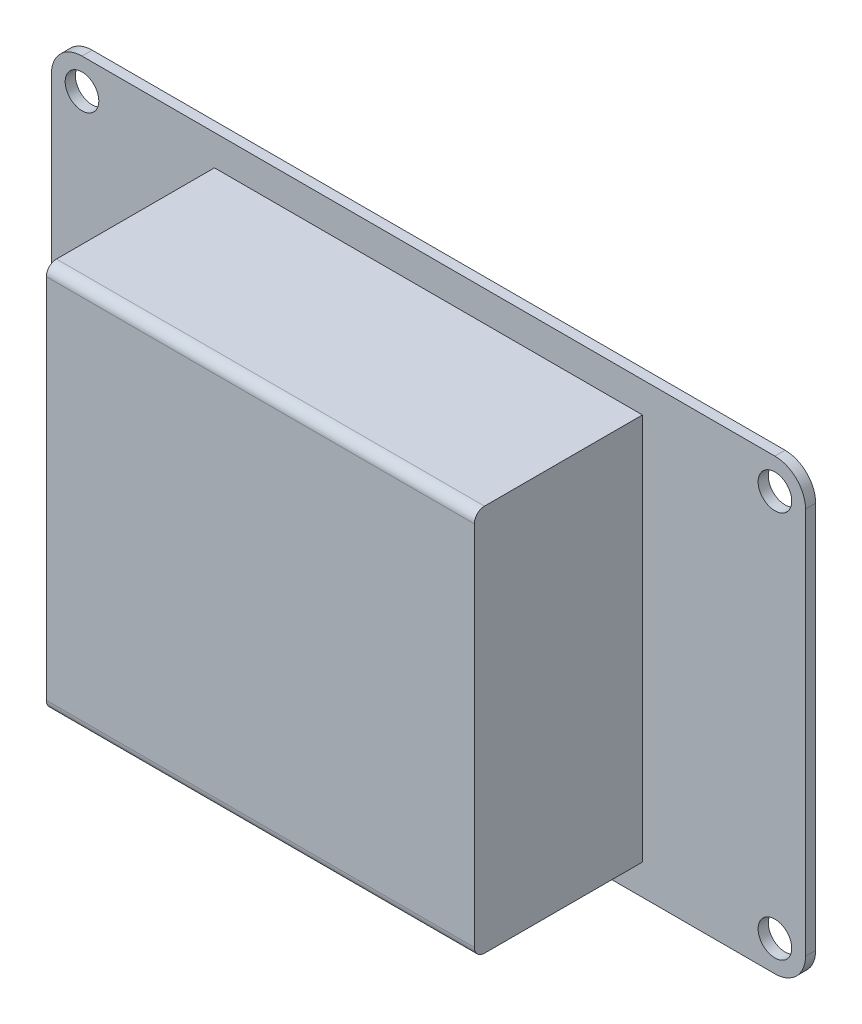
ISO-10303-21;
HEADER;
FILE_DESCRIPTION(('STEP AP214'),'2;1');
FILE_NAME('part.step','',(''),(''),'','','');
FILE_SCHEMA(('AUTOMOTIVE_DESIGN { 1 0 10303 214 1 1 1 1 }'));
ENDSEC;
DATA;
#1=APPLICATION_CONTEXT('core data for automotive mechanical design processes');
#2=APPLICATION_PROTOCOL_DEFINITION('international standard','automotive_design',2000,#1);
#3=PRODUCT_CONTEXT('',#1,'mechanical');
#4=PRODUCT('Part','Part','',(#3));
#5=PRODUCT_RELATED_PRODUCT_CATEGORY('part','',(#4));
#6=PRODUCT_DEFINITION_FORMATION('','',#4);
#7=PRODUCT_DEFINITION_CONTEXT('part definition',#1,'design');
#8=PRODUCT_DEFINITION('design','',#6,#7);
#9=PRODUCT_DEFINITION_SHAPE('','',#8);
#10=(LENGTH_UNIT() NAMED_UNIT(*) SI_UNIT(.MILLI.,.METRE.));
#11=(NAMED_UNIT(*) PLANE_ANGLE_UNIT() SI_UNIT($,.RADIAN.));
#12=(NAMED_UNIT(*) SI_UNIT($,.STERADIAN.) SOLID_ANGLE_UNIT());
#13=UNCERTAINTY_MEASURE_WITH_UNIT(LENGTH_MEASURE(1.E-05),#10,'distance_accuracy_value','');
#14=(GEOMETRIC_REPRESENTATION_CONTEXT(3) GLOBAL_UNCERTAINTY_ASSIGNED_CONTEXT((#13)) GLOBAL_UNIT_ASSIGNED_CONTEXT((#10,
#11,#12)) REPRESENTATION_CONTEXT('',''));
#15=CARTESIAN_POINT('',(0.,0.,0.));
#16=DIRECTION('',(0.,0.,1.));
#17=DIRECTION('',(1.,0.,0.));
#18=AXIS2_PLACEMENT_3D('',#15,#16,#17);
#19=CARTESIAN_POINT('',(34.,-19.,1.));
#20=DIRECTION('',(0.,0.,-1.));
#21=DIRECTION('',(-1.,0.,0.));
#22=AXIS2_PLACEMENT_3D('',#19,#20,#21);
#23=PLANE('',#22);
#24=CARTESIAN_POINT('',(34.,-18.9999999999991,1.));
#25=DIRECTION('',(0.,0.,1.));
#26=DIRECTION('',(1.,0.,0.));
#27=AXIS2_PLACEMENT_3D('',#24,#25,#26);
#28=CIRCLE('',#27,1.65);
#29=CARTESIAN_POINT('',(35.65,-18.9999999999991,1.));
#30=VERTEX_POINT('',#29);
#31=EDGE_CURVE('E174',#30,#30,#28,.T.);
#32=ORIENTED_EDGE('',*,*,#31,.F.);
#33=EDGE_LOOP('',(#32));
#34=FACE_BOUND('',#33,.T.);
#35=CARTESIAN_POINT('',(34.,19.0000000000009,1.));
#36=DIRECTION('',(0.,0.,1.));
#37=DIRECTION('',(1.,0.,0.));
#38=AXIS2_PLACEMENT_3D('',#35,#36,#37);
#39=CIRCLE('',#38,1.65);
#40=CARTESIAN_POINT('',(35.65,19.0000000000009,1.));
#41=VERTEX_POINT('',#40);
#42=EDGE_CURVE('E179',#41,#41,#39,.T.);
#43=ORIENTED_EDGE('',*,*,#42,.F.);
#44=EDGE_LOOP('',(#43));
#45=FACE_BOUND('',#44,.T.);
#46=CARTESIAN_POINT('',(-34.,19.,1.));
#47=DIRECTION('',(0.,0.,1.));
#48=DIRECTION('',(1.,0.,0.));
#49=AXIS2_PLACEMENT_3D('',#46,#47,#48);
#50=CIRCLE('',#49,1.65);
#51=CARTESIAN_POINT('',(-32.35,19.,1.));
#52=VERTEX_POINT('',#51);
#53=EDGE_CURVE('E183',#52,#52,#50,.T.);
#54=ORIENTED_EDGE('',*,*,#53,.F.);
#55=EDGE_LOOP('',(#54));
#56=FACE_BOUND('',#55,.T.);
#57=CARTESIAN_POINT('',(-34.,-19.,1.));
#58=DIRECTION('',(0.,0.,1.));
#59=DIRECTION('',(1.,0.,0.));
#60=AXIS2_PLACEMENT_3D('',#57,#58,#59);
#61=CIRCLE('',#60,1.65);
#62=CARTESIAN_POINT('',(-32.35,-19.,1.));
#63=VERTEX_POINT('',#62);
#64=EDGE_CURVE('E193',#63,#63,#61,.T.);
#65=ORIENTED_EDGE('',*,*,#64,.F.);
#66=EDGE_LOOP('',(#65));
#67=FACE_BOUND('',#66,.T.);
#68=CARTESIAN_POINT('',(34.,-19.,1.));
#69=DIRECTION('',(0.,0.,1.));
#70=DIRECTION('',(-1.,0.,0.));
#71=AXIS2_PLACEMENT_3D('',#68,#69,#70);
#72=CIRCLE('',#71,3.);
#73=CARTESIAN_POINT('',(34.,-22.,1.));
#74=VERTEX_POINT('',#73);
#75=CARTESIAN_POINT('',(37.,-19.,1.));
#76=VERTEX_POINT('',#75);
#77=EDGE_CURVE('E197',#74,#76,#72,.T.);
#78=ORIENTED_EDGE('',*,*,#77,.T.);
#79=DIRECTION('',(0.,1.,0.));
#80=VECTOR('',#79,1.);
#81=CARTESIAN_POINT('',(37.,-19.,1.));
#82=LINE('',#81,#80);
#83=CARTESIAN_POINT('',(37.,19.,1.));
#84=VERTEX_POINT('',#83);
#85=EDGE_CURVE('E199',#76,#84,#82,.T.);
#86=ORIENTED_EDGE('',*,*,#85,.T.);
#87=CARTESIAN_POINT('',(34.,19.,1.));
#88=DIRECTION('',(0.,0.,1.));
#89=DIRECTION('',(1.,0.,0.));
#90=AXIS2_PLACEMENT_3D('',#87,#88,#89);
#91=CIRCLE('',#90,3.);
#92=CARTESIAN_POINT('',(34.,22.,1.));
#93=VERTEX_POINT('',#92);
#94=EDGE_CURVE('E201',#84,#93,#91,.T.);
#95=ORIENTED_EDGE('',*,*,#94,.T.);
#96=DIRECTION('',(-1.,0.,0.));
#97=VECTOR('',#96,1.);
#98=CARTESIAN_POINT('',(34.,22.,1.));
#99=LINE('',#98,#97);
#100=CARTESIAN_POINT('',(-34.,22.,1.));
#101=VERTEX_POINT('',#100);
#102=EDGE_CURVE('E202',#93,#101,#99,.T.);
#103=ORIENTED_EDGE('',*,*,#102,.T.);
#104=CARTESIAN_POINT('',(-34.,19.,1.));
#105=DIRECTION('',(0.,0.,1.));
#106=DIRECTION('',(-1.,0.,0.));
#107=AXIS2_PLACEMENT_3D('',#104,#105,#106);
#108=CIRCLE('',#107,3.);
#109=CARTESIAN_POINT('',(-37.,19.,1.));
#110=VERTEX_POINT('',#109);
#111=EDGE_CURVE('E210',#101,#110,#108,.T.);
#112=ORIENTED_EDGE('',*,*,#111,.T.);
#113=DIRECTION('',(0.,-1.,0.));
#114=VECTOR('',#113,1.);
#115=CARTESIAN_POINT('',(-37.,-19.,1.));
#116=LINE('',#115,#114);
#117=CARTESIAN_POINT('',(-37.,-19.,1.));
#118=VERTEX_POINT('',#117);
#119=EDGE_CURVE('E207',#110,#118,#116,.T.);
#120=ORIENTED_EDGE('',*,*,#119,.T.);
#121=CARTESIAN_POINT('',(-34.,-19.,1.));
#122=DIRECTION('',(0.,0.,1.));
#123=DIRECTION('',(-1.,0.,0.));
#124=AXIS2_PLACEMENT_3D('',#121,#122,#123);
#125=CIRCLE('',#124,3.);
#126=CARTESIAN_POINT('',(-34.,-22.,1.));
#127=VERTEX_POINT('',#126);
#128=EDGE_CURVE('E211',#118,#127,#125,.T.);
#129=ORIENTED_EDGE('',*,*,#128,.T.);
#130=DIRECTION('',(1.,0.,0.));
#131=VECTOR('',#130,1.);
#132=CARTESIAN_POINT('',(34.,-22.,1.));
#133=LINE('',#132,#131);
#134=EDGE_CURVE('E213',#127,#74,#133,.T.);
#135=ORIENTED_EDGE('',*,*,#134,.T.);
#136=EDGE_LOOP('',(#78,#86,#95,#103,#112,#120,#129,#135));
#137=FACE_BOUND('',#136,.T.);
#138=DIRECTION('',(0.,1.,0.));
#139=VECTOR('',#138,1.);
#140=CARTESIAN_POINT('',(21.,-19.,1.));
#141=LINE('',#140,#139);
#142=CARTESIAN_POINT('',(21.,-19.,1.));
#143=VERTEX_POINT('',#142);
#144=CARTESIAN_POINT('',(21.,19.,1.));
#145=VERTEX_POINT('',#144);
#146=EDGE_CURVE('E159',#143,#145,#141,.T.);
#147=ORIENTED_EDGE('',*,*,#146,.F.);
#148=DIRECTION('',(1.,0.,0.));
#149=VECTOR('',#148,1.);
#150=CARTESIAN_POINT('',(-21.,-19.,1.));
#151=LINE('',#150,#149);
#152=CARTESIAN_POINT('',(-21.,-19.,1.));
#153=VERTEX_POINT('',#152);
#154=EDGE_CURVE('E160',#153,#143,#151,.T.);
#155=ORIENTED_EDGE('',*,*,#154,.F.);
#156=DIRECTION('',(0.,-1.,0.));
#157=VECTOR('',#156,1.);
#158=CARTESIAN_POINT('',(-21.,-19.,1.));
#159=LINE('',#158,#157);
#160=CARTESIAN_POINT('',(-21.,19.,1.));
#161=VERTEX_POINT('',#160);
#162=EDGE_CURVE('E145',#161,#153,#159,.T.);
#163=ORIENTED_EDGE('',*,*,#162,.F.);
#164=DIRECTION('',(-1.,0.,0.));
#165=VECTOR('',#164,1.);
#166=CARTESIAN_POINT('',(-21.,19.,1.));
#167=LINE('',#166,#165);
#168=EDGE_CURVE('E152',#145,#161,#167,.T.);
#169=ORIENTED_EDGE('',*,*,#168,.F.);
#170=EDGE_LOOP('',(#147,#155,#163,#169));
#171=FACE_BOUND('',#170,.T.);
#172=ADVANCED_FACE('F39',(#34,#45,#56,#67,#137,#171),#23,.F.);
#173=CARTESIAN_POINT('',(34.,-19.,0.));
#174=DIRECTION('',(0.,0.,-1.));
#175=DIRECTION('',(-1.,0.,0.));
#176=AXIS2_PLACEMENT_3D('',#173,#174,#175);
#177=PLANE('',#176);
#178=CARTESIAN_POINT('',(34.,19.0000000000009,0.));
#179=DIRECTION('',(0.,0.,1.));
#180=DIRECTION('',(1.,0.,0.));
#181=AXIS2_PLACEMENT_3D('',#178,#179,#180);
#182=CIRCLE('',#181,1.65);
#183=CARTESIAN_POINT('',(35.65,19.0000000000009,0.));
#184=VERTEX_POINT('',#183);
#185=EDGE_CURVE('E178',#184,#184,#182,.T.);
#186=ORIENTED_EDGE('',*,*,#185,.T.);
#187=EDGE_LOOP('',(#186));
#188=FACE_BOUND('',#187,.T.);
#189=CARTESIAN_POINT('',(-34.,-19.,0.));
#190=DIRECTION('',(0.,0.,1.));
#191=DIRECTION('',(1.,0.,0.));
#192=AXIS2_PLACEMENT_3D('',#189,#190,#191);
#193=CIRCLE('',#192,1.65);
#194=CARTESIAN_POINT('',(-32.35,-19.,0.));
#195=VERTEX_POINT('',#194);
#196=EDGE_CURVE('E189',#195,#195,#193,.T.);
#197=ORIENTED_EDGE('',*,*,#196,.T.);
#198=EDGE_LOOP('',(#197));
#199=FACE_BOUND('',#198,.T.);
#200=CARTESIAN_POINT('',(34.,-19.,0.));
#201=DIRECTION('',(0.,0.,1.));
#202=DIRECTION('',(-1.,0.,0.));
#203=AXIS2_PLACEMENT_3D('',#200,#201,#202);
#204=CIRCLE('',#203,3.);
#205=CARTESIAN_POINT('',(34.,-22.,0.));
#206=VERTEX_POINT('',#205);
#207=CARTESIAN_POINT('',(37.,-19.,0.));
#208=VERTEX_POINT('',#207);
#209=EDGE_CURVE('E194',#206,#208,#204,.T.);
#210=ORIENTED_EDGE('',*,*,#209,.F.);
#211=DIRECTION('',(1.,0.,0.));
#212=VECTOR('',#211,1.);
#213=CARTESIAN_POINT('',(34.,-22.,0.));
#214=LINE('',#213,#212);
#215=CARTESIAN_POINT('',(-34.,-22.,0.));
#216=VERTEX_POINT('',#215);
#217=EDGE_CURVE('E203',#216,#206,#214,.T.);
#218=ORIENTED_EDGE('',*,*,#217,.F.);
#219=CARTESIAN_POINT('',(-34.,-19.,0.));
#220=DIRECTION('',(0.,0.,1.));
#221=DIRECTION('',(-1.,0.,0.));
#222=AXIS2_PLACEMENT_3D('',#219,#220,#221);
#223=CIRCLE('',#222,3.);
#224=CARTESIAN_POINT('',(-37.,-19.,0.));
#225=VERTEX_POINT('',#224);
#226=EDGE_CURVE('E229',#225,#216,#223,.T.);
#227=ORIENTED_EDGE('',*,*,#226,.F.);
#228=DIRECTION('',(0.,-1.,0.));
#229=VECTOR('',#228,1.);
#230=CARTESIAN_POINT('',(-37.,-19.,0.));
#231=LINE('',#230,#229);
#232=CARTESIAN_POINT('',(-37.,19.,0.));
#233=VERTEX_POINT('',#232);
#234=EDGE_CURVE('E227',#233,#225,#231,.T.);
#235=ORIENTED_EDGE('',*,*,#234,.F.);
#236=CARTESIAN_POINT('',(-34.,19.,0.));
#237=DIRECTION('',(0.,0.,1.));
#238=DIRECTION('',(-1.,0.,0.));
#239=AXIS2_PLACEMENT_3D('',#236,#237,#238);
#240=CIRCLE('',#239,3.);
#241=CARTESIAN_POINT('',(-34.,22.,0.));
#242=VERTEX_POINT('',#241);
#243=EDGE_CURVE('E221',#242,#233,#240,.T.);
#244=ORIENTED_EDGE('',*,*,#243,.F.);
#245=DIRECTION('',(-1.,0.,0.));
#246=VECTOR('',#245,1.);
#247=CARTESIAN_POINT('',(34.,22.,0.));
#248=LINE('',#247,#246);
#249=CARTESIAN_POINT('',(34.,22.,0.));
#250=VERTEX_POINT('',#249);
#251=EDGE_CURVE('E225',#250,#242,#248,.T.);
#252=ORIENTED_EDGE('',*,*,#251,.F.);
#253=CARTESIAN_POINT('',(34.,19.,0.));
#254=DIRECTION('',(0.,0.,1.));
#255=DIRECTION('',(1.,0.,0.));
#256=AXIS2_PLACEMENT_3D('',#253,#254,#255);
#257=CIRCLE('',#256,3.);
#258=CARTESIAN_POINT('',(37.,19.,0.));
#259=VERTEX_POINT('',#258);
#260=EDGE_CURVE('E219',#259,#250,#257,.T.);
#261=ORIENTED_EDGE('',*,*,#260,.F.);
#262=DIRECTION('',(0.,1.,0.));
#263=VECTOR('',#262,1.);
#264=CARTESIAN_POINT('',(37.,-19.,0.));
#265=LINE('',#264,#263);
#266=EDGE_CURVE('E217',#208,#259,#265,.T.);
#267=ORIENTED_EDGE('',*,*,#266,.F.);
#268=EDGE_LOOP('',(#210,#218,#227,#235,#244,#252,#261,#267));
#269=FACE_BOUND('',#268,.T.);
#270=CARTESIAN_POINT('',(-34.,19.,0.));
#271=DIRECTION('',(0.,0.,1.));
#272=DIRECTION('',(1.,0.,0.));
#273=AXIS2_PLACEMENT_3D('',#270,#271,#272);
#274=CIRCLE('',#273,1.65);
#275=CARTESIAN_POINT('',(-32.35,19.,0.));
#276=VERTEX_POINT('',#275);
#277=EDGE_CURVE('E185',#276,#276,#274,.T.);
#278=ORIENTED_EDGE('',*,*,#277,.T.);
#279=EDGE_LOOP('',(#278));
#280=FACE_BOUND('',#279,.T.);
#281=CARTESIAN_POINT('',(34.,-18.9999999999991,0.));
#282=DIRECTION('',(0.,0.,1.));
#283=DIRECTION('',(1.,0.,0.));
#284=AXIS2_PLACEMENT_3D('',#281,#282,#283);
#285=CIRCLE('',#284,1.65);
#286=CARTESIAN_POINT('',(35.65,-18.9999999999991,0.));
#287=VERTEX_POINT('',#286);
#288=EDGE_CURVE('E175',#287,#287,#285,.T.);
#289=ORIENTED_EDGE('',*,*,#288,.T.);
#290=EDGE_LOOP('',(#289));
#291=FACE_BOUND('',#290,.T.);
#292=ADVANCED_FACE('F283',(#188,#199,#269,#280,#291),#177,.T.);
#293=CARTESIAN_POINT('',(34.,-19.,1.));
#294=DIRECTION('',(0.,0.,-1.));
#295=DIRECTION('',(-1.,0.,0.));
#296=AXIS2_PLACEMENT_3D('',#293,#294,#295);
#297=CYLINDRICAL_SURFACE('',#296,3.);
#298=ORIENTED_EDGE('',*,*,#209,.T.);
#299=DIRECTION('',(0.,0.,-1.));
#300=VECTOR('',#299,1.);
#301=CARTESIAN_POINT('',(37.,-19.,1.));
#302=LINE('',#301,#300);
#303=EDGE_CURVE('E253',#76,#208,#302,.T.);
#304=ORIENTED_EDGE('',*,*,#303,.F.);
#305=ORIENTED_EDGE('',*,*,#77,.F.);
#306=DIRECTION('',(0.,0.,-1.));
#307=VECTOR('',#306,1.);
#308=CARTESIAN_POINT('',(34.,-22.,1.));
#309=LINE('',#308,#307);
#310=EDGE_CURVE('E214',#74,#206,#309,.T.);
#311=ORIENTED_EDGE('',*,*,#310,.T.);
#312=EDGE_LOOP('',(#298,#304,#305,#311));
#313=FACE_BOUND('',#312,.T.);
#314=ADVANCED_FACE('F291',(#313),#297,.T.);
#315=CARTESIAN_POINT('',(37.,-19.,1.));
#316=DIRECTION('',(-1.,0.,0.));
#317=DIRECTION('',(0.,0.,1.));
#318=AXIS2_PLACEMENT_3D('',#315,#316,#317);
#319=PLANE('',#318);
#320=ORIENTED_EDGE('',*,*,#266,.T.);
#321=DIRECTION('',(0.,0.,-1.));
#322=VECTOR('',#321,1.);
#323=CARTESIAN_POINT('',(37.,19.,1.));
#324=LINE('',#323,#322);
#325=EDGE_CURVE('E246',#84,#259,#324,.T.);
#326=ORIENTED_EDGE('',*,*,#325,.F.);
#327=ORIENTED_EDGE('',*,*,#85,.F.);
#328=ORIENTED_EDGE('',*,*,#303,.T.);
#329=EDGE_LOOP('',(#320,#326,#327,#328));
#330=FACE_BOUND('',#329,.T.);
#331=ADVANCED_FACE('F324',(#330),#319,.F.);
#332=CARTESIAN_POINT('',(34.,19.,1.));
#333=DIRECTION('',(0.,0.,-1.));
#334=DIRECTION('',(-1.,0.,0.));
#335=AXIS2_PLACEMENT_3D('',#332,#333,#334);
#336=CYLINDRICAL_SURFACE('',#335,3.);
#337=ORIENTED_EDGE('',*,*,#260,.T.);
#338=DIRECTION('',(0.,0.,-1.));
#339=VECTOR('',#338,1.);
#340=CARTESIAN_POINT('',(34.,22.,1.));
#341=LINE('',#340,#339);
#342=EDGE_CURVE('E243',#93,#250,#341,.T.);
#343=ORIENTED_EDGE('',*,*,#342,.F.);
#344=ORIENTED_EDGE('',*,*,#94,.F.);
#345=ORIENTED_EDGE('',*,*,#325,.T.);
#346=EDGE_LOOP('',(#337,#343,#344,#345));
#347=FACE_BOUND('',#346,.T.);
#348=ADVANCED_FACE('F321',(#347),#336,.T.);
#349=CARTESIAN_POINT('',(34.,22.,1.));
#350=DIRECTION('',(0.,-1.,0.));
#351=DIRECTION('',(0.,0.,-1.));
#352=AXIS2_PLACEMENT_3D('',#349,#350,#351);
#353=PLANE('',#352);
#354=ORIENTED_EDGE('',*,*,#251,.T.);
#355=DIRECTION('',(0.,0.,-1.));
#356=VECTOR('',#355,1.);
#357=CARTESIAN_POINT('',(-34.,22.,1.));
#358=LINE('',#357,#356);
#359=EDGE_CURVE('E245',#101,#242,#358,.T.);
#360=ORIENTED_EDGE('',*,*,#359,.F.);
#361=ORIENTED_EDGE('',*,*,#102,.F.);
#362=ORIENTED_EDGE('',*,*,#342,.T.);
#363=EDGE_LOOP('',(#354,#360,#361,#362));
#364=FACE_BOUND('',#363,.T.);
#365=ADVANCED_FACE('F320',(#364),#353,.F.);
#366=CARTESIAN_POINT('',(-34.,19.,1.));
#367=DIRECTION('',(0.,0.,-1.));
#368=DIRECTION('',(-1.,0.,0.));
#369=AXIS2_PLACEMENT_3D('',#366,#367,#368);
#370=CYLINDRICAL_SURFACE('',#369,3.);
#371=ORIENTED_EDGE('',*,*,#243,.T.);
#372=DIRECTION('',(0.,0.,-1.));
#373=VECTOR('',#372,1.);
#374=CARTESIAN_POINT('',(-37.,19.,1.));
#375=LINE('',#374,#373);
#376=EDGE_CURVE('E239',#110,#233,#375,.T.);
#377=ORIENTED_EDGE('',*,*,#376,.F.);
#378=ORIENTED_EDGE('',*,*,#111,.F.);
#379=ORIENTED_EDGE('',*,*,#359,.T.);
#380=EDGE_LOOP('',(#371,#377,#378,#379));
#381=FACE_BOUND('',#380,.T.);
#382=ADVANCED_FACE('F311',(#381),#370,.T.);
#383=CARTESIAN_POINT('',(-37.,-19.,1.));
#384=DIRECTION('',(1.,0.,0.));
#385=DIRECTION('',(0.,0.,-1.));
#386=AXIS2_PLACEMENT_3D('',#383,#384,#385);
#387=PLANE('',#386);
#388=ORIENTED_EDGE('',*,*,#234,.T.);
#389=DIRECTION('',(0.,0.,-1.));
#390=VECTOR('',#389,1.);
#391=CARTESIAN_POINT('',(-37.,-19.,1.));
#392=LINE('',#391,#390);
#393=EDGE_CURVE('E237',#118,#225,#392,.T.);
#394=ORIENTED_EDGE('',*,*,#393,.F.);
#395=ORIENTED_EDGE('',*,*,#119,.F.);
#396=ORIENTED_EDGE('',*,*,#376,.T.);
#397=EDGE_LOOP('',(#388,#394,#395,#396));
#398=FACE_BOUND('',#397,.T.);
#399=ADVANCED_FACE('F310',(#398),#387,.F.);
#400=CARTESIAN_POINT('',(-34.,-19.,1.));
#401=DIRECTION('',(0.,0.,-1.));
#402=DIRECTION('',(-1.,0.,0.));
#403=AXIS2_PLACEMENT_3D('',#400,#401,#402);
#404=CYLINDRICAL_SURFACE('',#403,3.);
#405=ORIENTED_EDGE('',*,*,#226,.T.);
#406=DIRECTION('',(0.,0.,-1.));
#407=VECTOR('',#406,1.);
#408=CARTESIAN_POINT('',(-34.,-22.,1.));
#409=LINE('',#408,#407);
#410=EDGE_CURVE('E231',#127,#216,#409,.T.);
#411=ORIENTED_EDGE('',*,*,#410,.F.);
#412=ORIENTED_EDGE('',*,*,#128,.F.);
#413=ORIENTED_EDGE('',*,*,#393,.T.);
#414=EDGE_LOOP('',(#405,#411,#412,#413));
#415=FACE_BOUND('',#414,.T.);
#416=ADVANCED_FACE('F302',(#415),#404,.T.);
#417=CARTESIAN_POINT('',(34.,-22.,1.));
#418=DIRECTION('',(0.,1.,0.));
#419=DIRECTION('',(0.,0.,1.));
#420=AXIS2_PLACEMENT_3D('',#417,#418,#419);
#421=PLANE('',#420);
#422=ORIENTED_EDGE('',*,*,#217,.T.);
#423=ORIENTED_EDGE('',*,*,#310,.F.);
#424=ORIENTED_EDGE('',*,*,#134,.F.);
#425=ORIENTED_EDGE('',*,*,#410,.T.);
#426=EDGE_LOOP('',(#422,#423,#424,#425));
#427=FACE_BOUND('',#426,.T.);
#428=ADVANCED_FACE('F305',(#427),#421,.F.);
#429=CARTESIAN_POINT('',(-34.,-19.,1.));
#430=DIRECTION('',(0.,0.,-1.));
#431=DIRECTION('',(-1.,0.,0.));
#432=AXIS2_PLACEMENT_3D('',#429,#430,#431);
#433=CYLINDRICAL_SURFACE('',#432,1.65);
#434=ORIENTED_EDGE('',*,*,#64,.T.);
#435=EDGE_LOOP('',(#434));
#436=FACE_BOUND('',#435,.T.);
#437=ORIENTED_EDGE('',*,*,#196,.F.);
#438=EDGE_LOOP('',(#437));
#439=FACE_BOUND('',#438,.T.);
#440=ADVANCED_FACE('F296',(#436,#439),#433,.F.);
#441=CARTESIAN_POINT('',(-34.,19.,1.));
#442=DIRECTION('',(0.,0.,-1.));
#443=DIRECTION('',(-1.,0.,0.));
#444=AXIS2_PLACEMENT_3D('',#441,#442,#443);
#445=CYLINDRICAL_SURFACE('',#444,1.65);
#446=ORIENTED_EDGE('',*,*,#53,.T.);
#447=EDGE_LOOP('',(#446));
#448=FACE_BOUND('',#447,.T.);
#449=ORIENTED_EDGE('',*,*,#277,.F.);
#450=EDGE_LOOP('',(#449));
#451=FACE_BOUND('',#450,.T.);
#452=ADVANCED_FACE('F367',(#448,#451),#445,.F.);
#453=CARTESIAN_POINT('',(34.,19.0000000000009,1.));
#454=DIRECTION('',(0.,0.,-1.));
#455=DIRECTION('',(-1.,0.,0.));
#456=AXIS2_PLACEMENT_3D('',#453,#454,#455);
#457=CYLINDRICAL_SURFACE('',#456,1.65);
#458=ORIENTED_EDGE('',*,*,#42,.T.);
#459=EDGE_LOOP('',(#458));
#460=FACE_BOUND('',#459,.T.);
#461=ORIENTED_EDGE('',*,*,#185,.F.);
#462=EDGE_LOOP('',(#461));
#463=FACE_BOUND('',#462,.T.);
#464=ADVANCED_FACE('F361',(#460,#463),#457,.F.);
#465=CARTESIAN_POINT('',(34.,-18.9999999999991,1.));
#466=DIRECTION('',(0.,0.,-1.));
#467=DIRECTION('',(-1.,0.,0.));
#468=AXIS2_PLACEMENT_3D('',#465,#466,#467);
#469=CYLINDRICAL_SURFACE('',#468,1.65);
#470=ORIENTED_EDGE('',*,*,#31,.T.);
#471=EDGE_LOOP('',(#470));
#472=FACE_BOUND('',#471,.T.);
#473=ORIENTED_EDGE('',*,*,#288,.F.);
#474=EDGE_LOOP('',(#473));
#475=FACE_BOUND('',#474,.T.);
#476=ADVANCED_FACE('F362',(#472,#475),#469,.F.);
#477=CARTESIAN_POINT('',(21.,-19.,17.5));
#478=DIRECTION('',(-1.,0.,0.));
#479=DIRECTION('',(0.,0.,1.));
#480=AXIS2_PLACEMENT_3D('',#477,#478,#479);
#481=PLANE('',#480);
#482=DIRECTION('',(0.,0.,-1.));
#483=VECTOR('',#482,1.);
#484=CARTESIAN_POINT('',(21.,19.,17.5));
#485=LINE('',#484,#483);
#486=CARTESIAN_POINT('',(21.,19.,16.5));
#487=VERTEX_POINT('',#486);
#488=EDGE_CURVE('E150',#487,#145,#485,.T.);
#489=ORIENTED_EDGE('',*,*,#488,.F.);
#490=CARTESIAN_POINT('',(21.,18.,16.5));
#491=DIRECTION('',(-1.,0.,0.));
#492=DIRECTION('',(0.,0.,1.));
#493=AXIS2_PLACEMENT_3D('',#490,#491,#492);
#494=CIRCLE('',#493,1.);
#495=CARTESIAN_POINT('',(21.,18.,17.5));
#496=VERTEX_POINT('',#495);
#497=EDGE_CURVE('E50',#487,#496,#494,.F.);
#498=ORIENTED_EDGE('',*,*,#497,.T.);
#499=DIRECTION('',(0.,1.,0.));
#500=VECTOR('',#499,1.);
#501=CARTESIAN_POINT('',(21.,-19.,17.5));
#502=LINE('',#501,#500);
#503=CARTESIAN_POINT('',(21.,-18.,17.5));
#504=VERTEX_POINT('',#503);
#505=EDGE_CURVE('E167',#504,#496,#502,.T.);
#506=ORIENTED_EDGE('',*,*,#505,.F.);
#507=CARTESIAN_POINT('',(21.,-18.,16.5));
#508=DIRECTION('',(-1.,0.,0.));
#509=DIRECTION('',(0.,0.,1.));
#510=AXIS2_PLACEMENT_3D('',#507,#508,#509);
#511=CIRCLE('',#510,1.);
#512=CARTESIAN_POINT('',(21.,-19.,16.5));
#513=VERTEX_POINT('',#512);
#514=EDGE_CURVE('E53',#504,#513,#511,.F.);
#515=ORIENTED_EDGE('',*,*,#514,.T.);
#516=DIRECTION('',(0.,0.,-1.));
#517=VECTOR('',#516,1.);
#518=CARTESIAN_POINT('',(21.,-19.,17.5));
#519=LINE('',#518,#517);
#520=EDGE_CURVE('E170',#513,#143,#519,.T.);
#521=ORIENTED_EDGE('',*,*,#520,.T.);
#522=ORIENTED_EDGE('',*,*,#146,.T.);
#523=EDGE_LOOP('',(#489,#498,#506,#515,#521,#522));
#524=FACE_BOUND('',#523,.T.);
#525=ADVANCED_FACE('F266',(#524),#481,.F.);
#526=CARTESIAN_POINT('',(-21.,19.,17.5));
#527=DIRECTION('',(0.,-1.,0.));
#528=DIRECTION('',(0.,0.,-1.));
#529=AXIS2_PLACEMENT_3D('',#526,#527,#528);
#530=PLANE('',#529);
#531=DIRECTION('',(0.,0.,-1.));
#532=VECTOR('',#531,1.);
#533=CARTESIAN_POINT('',(-21.,19.,17.5));
#534=LINE('',#533,#532);
#535=CARTESIAN_POINT('',(-21.,19.,16.5));
#536=VERTEX_POINT('',#535);
#537=EDGE_CURVE('E139',#536,#161,#534,.T.);
#538=ORIENTED_EDGE('',*,*,#537,.F.);
#539=DIRECTION('',(-1.,0.,0.));
#540=VECTOR('',#539,1.);
#541=CARTESIAN_POINT('',(-21.,19.,16.5));
#542=LINE('',#541,#540);
#543=EDGE_CURVE('E65',#536,#487,#542,.F.);
#544=ORIENTED_EDGE('',*,*,#543,.T.);
#545=ORIENTED_EDGE('',*,*,#488,.T.);
#546=ORIENTED_EDGE('',*,*,#168,.T.);
#547=EDGE_LOOP('',(#538,#544,#545,#546));
#548=FACE_BOUND('',#547,.T.);
#549=ADVANCED_FACE('F157',(#548),#530,.F.);
#550=CARTESIAN_POINT('',(-21.,-19.,17.5));
#551=DIRECTION('',(1.,0.,0.));
#552=DIRECTION('',(0.,0.,-1.));
#553=AXIS2_PLACEMENT_3D('',#550,#551,#552);
#554=PLANE('',#553);
#555=DIRECTION('',(0.,-1.,0.));
#556=VECTOR('',#555,1.);
#557=CARTESIAN_POINT('',(-21.,-19.,17.5));
#558=LINE('',#557,#556);
#559=CARTESIAN_POINT('',(-21.,18.,17.5));
#560=VERTEX_POINT('',#559);
#561=CARTESIAN_POINT('',(-21.,-18.,17.5));
#562=VERTEX_POINT('',#561);
#563=EDGE_CURVE('E166',#560,#562,#558,.T.);
#564=ORIENTED_EDGE('',*,*,#563,.F.);
#565=CARTESIAN_POINT('',(-21.,18.,16.5));
#566=DIRECTION('',(1.,0.,0.));
#567=DIRECTION('',(0.,0.,-1.));
#568=AXIS2_PLACEMENT_3D('',#565,#566,#567);
#569=CIRCLE('',#568,1.);
#570=EDGE_CURVE('E144',#560,#536,#569,.F.);
#571=ORIENTED_EDGE('',*,*,#570,.T.);
#572=ORIENTED_EDGE('',*,*,#537,.T.);
#573=ORIENTED_EDGE('',*,*,#162,.T.);
#574=DIRECTION('',(0.,0.,-1.));
#575=VECTOR('',#574,1.);
#576=CARTESIAN_POINT('',(-21.,-19.,17.5));
#577=LINE('',#576,#575);
#578=CARTESIAN_POINT('',(-21.,-19.,16.5));
#579=VERTEX_POINT('',#578);
#580=EDGE_CURVE('E146',#579,#153,#577,.T.);
#581=ORIENTED_EDGE('',*,*,#580,.F.);
#582=CARTESIAN_POINT('',(-21.,-18.,16.5));
#583=DIRECTION('',(1.,0.,0.));
#584=DIRECTION('',(0.,0.,-1.));
#585=AXIS2_PLACEMENT_3D('',#582,#583,#584);
#586=CIRCLE('',#585,1.);
#587=EDGE_CURVE('E257',#579,#562,#586,.F.);
#588=ORIENTED_EDGE('',*,*,#587,.T.);
#589=EDGE_LOOP('',(#564,#571,#572,#573,#581,#588));
#590=FACE_BOUND('',#589,.T.);
#591=ADVANCED_FACE('F142',(#590),#554,.F.);
#592=CARTESIAN_POINT('',(-21.,-19.,17.5));
#593=DIRECTION('',(0.,1.,0.));
#594=DIRECTION('',(0.,0.,1.));
#595=AXIS2_PLACEMENT_3D('',#592,#593,#594);
#596=PLANE('',#595);
#597=ORIENTED_EDGE('',*,*,#520,.F.);
#598=DIRECTION('',(1.,0.,0.));
#599=VECTOR('',#598,1.);
#600=CARTESIAN_POINT('',(-21.,-19.,16.5));
#601=LINE('',#600,#599);
#602=EDGE_CURVE('E11',#513,#579,#601,.F.);
#603=ORIENTED_EDGE('',*,*,#602,.T.);
#604=ORIENTED_EDGE('',*,*,#580,.T.);
#605=ORIENTED_EDGE('',*,*,#154,.T.);
#606=EDGE_LOOP('',(#597,#603,#604,#605));
#607=FACE_BOUND('',#606,.T.);
#608=ADVANCED_FACE('F282',(#607),#596,.F.);
#609=CARTESIAN_POINT('',(0.,0.,17.5));
#610=DIRECTION('',(0.,0.,-1.));
#611=DIRECTION('',(-1.,0.,0.));
#612=AXIS2_PLACEMENT_3D('',#609,#610,#611);
#613=PLANE('',#612);
#614=ORIENTED_EDGE('',*,*,#505,.T.);
#615=DIRECTION('',(-1.,0.,0.));
#616=VECTOR('',#615,1.);
#617=CARTESIAN_POINT('',(0.,18.,17.5));
#618=LINE('',#617,#616);
#619=EDGE_CURVE('E260',#496,#560,#618,.T.);
#620=ORIENTED_EDGE('',*,*,#619,.T.);
#621=ORIENTED_EDGE('',*,*,#563,.T.);
#622=DIRECTION('',(1.,0.,0.));
#623=VECTOR('',#622,1.);
#624=CARTESIAN_POINT('',(0.,-18.,17.5));
#625=LINE('',#624,#623);
#626=EDGE_CURVE('E255',#562,#504,#625,.T.);
#627=ORIENTED_EDGE('',*,*,#626,.T.);
#628=EDGE_LOOP('',(#614,#620,#621,#627));
#629=FACE_BOUND('',#628,.T.);
#630=ADVANCED_FACE('F269',(#629),#613,.F.);
#631=CARTESIAN_POINT('',(0.,18.,16.5));
#632=DIRECTION('',(-1.,0.,0.));
#633=DIRECTION('',(0.,0.,1.));
#634=AXIS2_PLACEMENT_3D('',#631,#632,#633);
#635=CYLINDRICAL_SURFACE('',#634,1.);
#636=ORIENTED_EDGE('',*,*,#497,.F.);
#637=ORIENTED_EDGE('',*,*,#543,.F.);
#638=ORIENTED_EDGE('',*,*,#570,.F.);
#639=ORIENTED_EDGE('',*,*,#619,.F.);
#640=EDGE_LOOP('',(#636,#637,#638,#639));
#641=FACE_BOUND('',#640,.T.);
#642=ADVANCED_FACE('F273',(#641),#635,.T.);
#643=CARTESIAN_POINT('',(0.,-18.,16.5));
#644=DIRECTION('',(1.,0.,0.));
#645=DIRECTION('',(0.,0.,-1.));
#646=AXIS2_PLACEMENT_3D('',#643,#644,#645);
#647=CYLINDRICAL_SURFACE('',#646,1.);
#648=ORIENTED_EDGE('',*,*,#587,.F.);
#649=ORIENTED_EDGE('',*,*,#602,.F.);
#650=ORIENTED_EDGE('',*,*,#514,.F.);
#651=ORIENTED_EDGE('',*,*,#626,.F.);
#652=EDGE_LOOP('',(#648,#649,#650,#651));
#653=FACE_BOUND('',#652,.T.);
#654=ADVANCED_FACE('F41',(#653),#647,.T.);
#655=CLOSED_SHELL('',(#172,#292,#314,#331,#348,#365,#382,#399,#416,#428,#440,#452,#464,#476,
#525,#549,#591,#608,#630,#642,#654));
#656=MANIFOLD_SOLID_BREP('B2',#655);
#657=ADVANCED_BREP_SHAPE_REPRESENTATION('',(#18,#656),#14);
#658=SHAPE_DEFINITION_REPRESENTATION(#9,#657);
ENDSEC;
END-ISO-10303-21;
